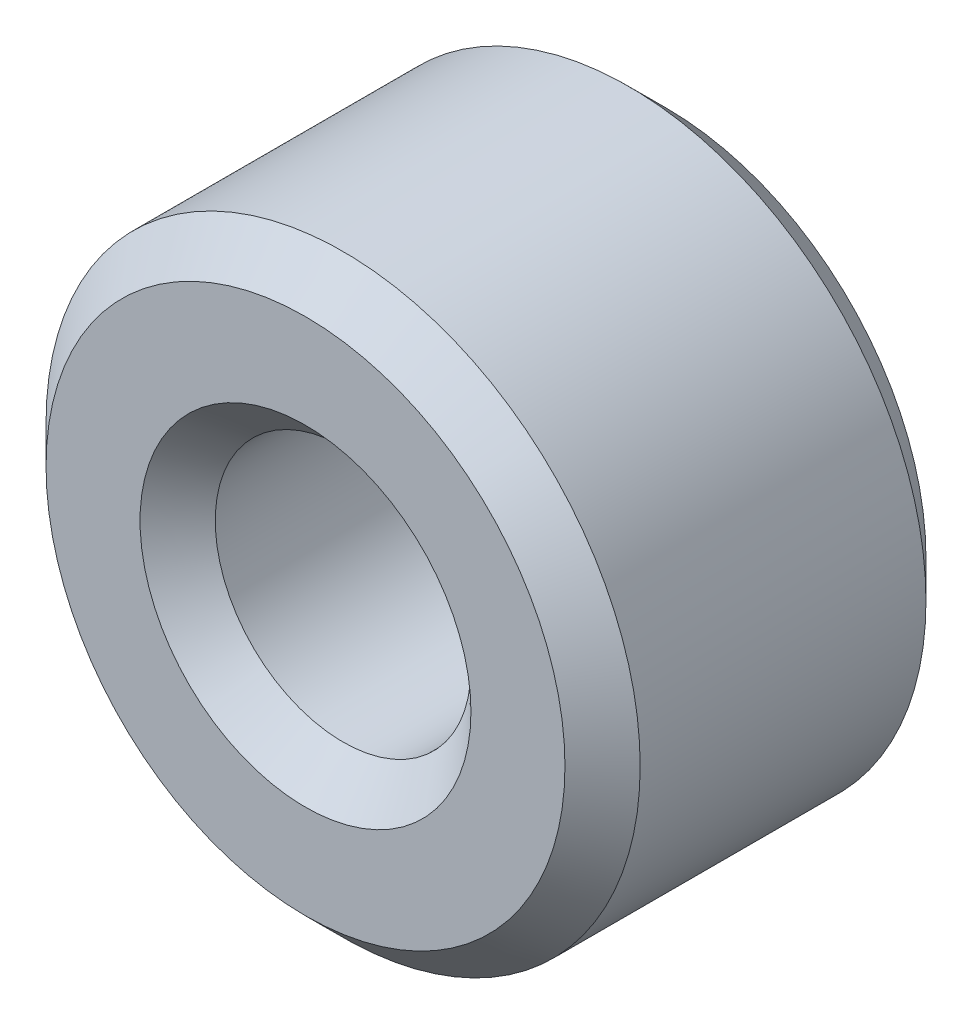
ISO-10303-21;
HEADER;
FILE_DESCRIPTION(('STEP AP214'),'2;1');
FILE_NAME('part.step','',(''),(''),'','','');
FILE_SCHEMA(('AUTOMOTIVE_DESIGN { 1 0 10303 214 1 1 1 1 }'));
ENDSEC;
DATA;
#1=APPLICATION_CONTEXT('core data for automotive mechanical design processes');
#2=APPLICATION_PROTOCOL_DEFINITION('international standard','automotive_design',2000,#1);
#3=PRODUCT_CONTEXT('',#1,'mechanical');
#4=PRODUCT('Part','Part','',(#3));
#5=PRODUCT_RELATED_PRODUCT_CATEGORY('part','',(#4));
#6=PRODUCT_DEFINITION_FORMATION('','',#4);
#7=PRODUCT_DEFINITION_CONTEXT('part definition',#1,'design');
#8=PRODUCT_DEFINITION('design','',#6,#7);
#9=PRODUCT_DEFINITION_SHAPE('','',#8);
#10=(LENGTH_UNIT() NAMED_UNIT(*) SI_UNIT(.MILLI.,.METRE.));
#11=(NAMED_UNIT(*) PLANE_ANGLE_UNIT() SI_UNIT($,.RADIAN.));
#12=(NAMED_UNIT(*) SI_UNIT($,.STERADIAN.) SOLID_ANGLE_UNIT());
#13=UNCERTAINTY_MEASURE_WITH_UNIT(LENGTH_MEASURE(1.E-05),#10,'distance_accuracy_value','');
#14=(GEOMETRIC_REPRESENTATION_CONTEXT(3) GLOBAL_UNCERTAINTY_ASSIGNED_CONTEXT((#13)) GLOBAL_UNIT_ASSIGNED_CONTEXT((#10,
#11,#12)) REPRESENTATION_CONTEXT('',''));
#15=CARTESIAN_POINT('',(0.,0.,0.));
#16=DIRECTION('',(0.,0.,1.));
#17=DIRECTION('',(1.,0.,0.));
#18=AXIS2_PLACEMENT_3D('',#15,#16,#17);
#19=CARTESIAN_POINT('',(-7.60000024181423,9.3620004416228,4.8));
#20=DIRECTION('',(0.,0.,1.));
#21=DIRECTION('',(1.,0.,0.));
#22=AXIS2_PLACEMENT_3D('',#19,#20,#21);
#23=PLANE('',#22);
#24=CARTESIAN_POINT('',(-7.60000024181423,9.3620004416228,4.8));
#25=DIRECTION('',(0.,0.,1.));
#26=DIRECTION('',(1.,0.,0.));
#27=AXIS2_PLACEMENT_3D('',#24,#25,#26);
#28=CIRCLE('',#27,2.2);
#29=CARTESIAN_POINT('',(-5.40000024181423,9.3620004416228,4.8));
#30=VERTEX_POINT('',#29);
#31=EDGE_CURVE('E10',#30,#30,#28,.F.);
#32=ORIENTED_EDGE('',*,*,#31,.T.);
#33=EDGE_LOOP('',(#32));
#34=FACE_BOUND('',#33,.T.);
#35=CARTESIAN_POINT('',(-7.60000024181423,9.3620004416228,4.8));
#36=DIRECTION('',(0.,0.,1.));
#37=DIRECTION('',(1.,0.,0.));
#38=AXIS2_PLACEMENT_3D('',#35,#36,#37);
#39=CIRCLE('',#38,3.45);
#40=CARTESIAN_POINT('',(-4.15000024181423,9.3620004416228,4.8));
#41=VERTEX_POINT('',#40);
#42=EDGE_CURVE('E39',#41,#41,#39,.T.);
#43=ORIENTED_EDGE('',*,*,#42,.T.);
#44=EDGE_LOOP('',(#43));
#45=FACE_BOUND('',#44,.T.);
#46=ADVANCED_FACE('F32',(#34,#45),#23,.T.);
#47=CARTESIAN_POINT('',(-7.60000024181423,9.3620004416228,0.));
#48=DIRECTION('',(0.,0.,1.));
#49=DIRECTION('',(1.,0.,0.));
#50=AXIS2_PLACEMENT_3D('',#47,#48,#49);
#51=PLANE('',#50);
#52=CARTESIAN_POINT('',(-7.60000024181423,9.3620004416228,0.));
#53=DIRECTION('',(0.,0.,1.));
#54=DIRECTION('',(1.,0.,0.));
#55=AXIS2_PLACEMENT_3D('',#52,#53,#54);
#56=CIRCLE('',#55,2.2);
#57=CARTESIAN_POINT('',(-5.40000024181423,9.3620004416228,0.));
#58=VERTEX_POINT('',#57);
#59=EDGE_CURVE('E58',#58,#58,#56,.T.);
#60=ORIENTED_EDGE('',*,*,#59,.T.);
#61=EDGE_LOOP('',(#60));
#62=FACE_BOUND('',#61,.T.);
#63=CARTESIAN_POINT('',(-7.60000024181423,9.3620004416228,0.));
#64=DIRECTION('',(0.,0.,1.));
#65=DIRECTION('',(1.,0.,0.));
#66=AXIS2_PLACEMENT_3D('',#63,#64,#65);
#67=CIRCLE('',#66,3.45);
#68=CARTESIAN_POINT('',(-4.15000024181423,9.3620004416228,0.));
#69=VERTEX_POINT('',#68);
#70=EDGE_CURVE('E61',#69,#69,#67,.F.);
#71=ORIENTED_EDGE('',*,*,#70,.T.);
#72=EDGE_LOOP('',(#71));
#73=FACE_BOUND('',#72,.T.);
#74=ADVANCED_FACE('F65',(#62,#73),#51,.F.);
#75=CARTESIAN_POINT('',(-7.60000024181423,9.3620004416228,4.8));
#76=DIRECTION('',(0.,0.,-1.));
#77=DIRECTION('',(-1.,0.,0.));
#78=AXIS2_PLACEMENT_3D('',#75,#76,#77);
#79=CYLINDRICAL_SURFACE('',#78,3.95);
#80=CARTESIAN_POINT('',(-7.60000024181423,9.3620004416228,0.500000000000001));
#81=DIRECTION('',(0.,0.,1.));
#82=DIRECTION('',(1.,0.,0.));
#83=AXIS2_PLACEMENT_3D('',#80,#81,#82);
#84=CIRCLE('',#83,3.95);
#85=CARTESIAN_POINT('',(-3.65000024181423,9.3620004416228,0.500000000000001));
#86=VERTEX_POINT('',#85);
#87=EDGE_CURVE('E43',#86,#86,#84,.T.);
#88=ORIENTED_EDGE('',*,*,#87,.T.);
#89=EDGE_LOOP('',(#88));
#90=FACE_BOUND('',#89,.T.);
#91=CARTESIAN_POINT('',(-7.60000024181423,9.3620004416228,4.3));
#92=DIRECTION('',(0.,0.,1.));
#93=DIRECTION('',(1.,0.,0.));
#94=AXIS2_PLACEMENT_3D('',#91,#92,#93);
#95=CIRCLE('',#94,3.95);
#96=CARTESIAN_POINT('',(-3.65000024181423,9.3620004416228,4.3));
#97=VERTEX_POINT('',#96);
#98=EDGE_CURVE('E47',#97,#97,#95,.F.);
#99=ORIENTED_EDGE('',*,*,#98,.T.);
#100=EDGE_LOOP('',(#99));
#101=FACE_BOUND('',#100,.T.);
#102=ADVANCED_FACE('F75',(#90,#101),#79,.T.);
#103=CARTESIAN_POINT('',(-7.60000024181423,9.3620004416228,4.8));
#104=DIRECTION('',(0.,0.,-1.));
#105=DIRECTION('',(-1.,0.,0.));
#106=AXIS2_PLACEMENT_3D('',#103,#104,#105);
#107=CYLINDRICAL_SURFACE('',#106,1.7);
#108=CARTESIAN_POINT('',(-7.60000024181423,9.3620004416228,0.500000000000001));
#109=DIRECTION('',(0.,0.,1.));
#110=DIRECTION('',(1.,0.,0.));
#111=AXIS2_PLACEMENT_3D('',#108,#109,#110);
#112=CIRCLE('',#111,1.7);
#113=CARTESIAN_POINT('',(-5.90000024181423,9.3620004416228,0.500000000000001));
#114=VERTEX_POINT('',#113);
#115=EDGE_CURVE('E52',#114,#114,#112,.F.);
#116=ORIENTED_EDGE('',*,*,#115,.T.);
#117=EDGE_LOOP('',(#116));
#118=FACE_BOUND('',#117,.T.);
#119=CARTESIAN_POINT('',(-7.60000024181423,9.3620004416228,4.3));
#120=DIRECTION('',(0.,0.,1.));
#121=DIRECTION('',(1.,0.,0.));
#122=AXIS2_PLACEMENT_3D('',#119,#120,#121);
#123=CIRCLE('',#122,1.7);
#124=CARTESIAN_POINT('',(-5.90000024181423,9.3620004416228,4.3));
#125=VERTEX_POINT('',#124);
#126=EDGE_CURVE('E55',#125,#125,#123,.T.);
#127=ORIENTED_EDGE('',*,*,#126,.T.);
#128=EDGE_LOOP('',(#127));
#129=FACE_BOUND('',#128,.T.);
#130=ADVANCED_FACE('F78',(#118,#129),#107,.F.);
#131=CARTESIAN_POINT('',(-7.60000024181423,9.3620004416228,0.));
#132=DIRECTION('',(0.,0.,-1.));
#133=DIRECTION('',(-1.,0.,0.));
#134=AXIS2_PLACEMENT_3D('',#131,#132,#133);
#135=CONICAL_SURFACE('',#134,2.2,0.785398163397447);
#136=ORIENTED_EDGE('',*,*,#115,.F.);
#137=EDGE_LOOP('',(#136));
#138=FACE_BOUND('',#137,.T.);
#139=ORIENTED_EDGE('',*,*,#59,.F.);
#140=EDGE_LOOP('',(#139));
#141=FACE_BOUND('',#140,.T.);
#142=ADVANCED_FACE('F71',(#138,#141),#135,.F.);
#143=CARTESIAN_POINT('',(-7.60000024181423,9.3620004416228,0.500000000000001));
#144=DIRECTION('',(0.,0.,1.));
#145=DIRECTION('',(1.,0.,0.));
#146=AXIS2_PLACEMENT_3D('',#143,#144,#145);
#147=CONICAL_SURFACE('',#146,3.95,0.785398163397448);
#148=ORIENTED_EDGE('',*,*,#70,.F.);
#149=EDGE_LOOP('',(#148));
#150=FACE_BOUND('',#149,.T.);
#151=ORIENTED_EDGE('',*,*,#87,.F.);
#152=EDGE_LOOP('',(#151));
#153=FACE_BOUND('',#152,.T.);
#154=ADVANCED_FACE('F67',(#150,#153),#147,.T.);
#155=CARTESIAN_POINT('',(-7.60000024181423,9.3620004416228,4.3));
#156=DIRECTION('',(0.,0.,1.));
#157=DIRECTION('',(1.,0.,0.));
#158=AXIS2_PLACEMENT_3D('',#155,#156,#157);
#159=CONICAL_SURFACE('',#158,1.7,0.785398163397448);
#160=ORIENTED_EDGE('',*,*,#31,.F.);
#161=EDGE_LOOP('',(#160));
#162=FACE_BOUND('',#161,.T.);
#163=ORIENTED_EDGE('',*,*,#126,.F.);
#164=EDGE_LOOP('',(#163));
#165=FACE_BOUND('',#164,.T.);
#166=ADVANCED_FACE('F70',(#162,#165),#159,.F.);
#167=CARTESIAN_POINT('',(-7.60000024181423,9.3620004416228,4.8));
#168=DIRECTION('',(0.,0.,-1.));
#169=DIRECTION('',(-1.,0.,0.));
#170=AXIS2_PLACEMENT_3D('',#167,#168,#169);
#171=CONICAL_SURFACE('',#170,3.45,0.785398163397446);
#172=ORIENTED_EDGE('',*,*,#98,.F.);
#173=EDGE_LOOP('',(#172));
#174=FACE_BOUND('',#173,.T.);
#175=ORIENTED_EDGE('',*,*,#42,.F.);
#176=EDGE_LOOP('',(#175));
#177=FACE_BOUND('',#176,.T.);
#178=ADVANCED_FACE('F34',(#174,#177),#171,.T.);
#179=CLOSED_SHELL('',(#46,#74,#102,#130,#142,#154,#166,#178));
#180=MANIFOLD_SOLID_BREP('B2',#179);
#181=ADVANCED_BREP_SHAPE_REPRESENTATION('',(#18,#180),#14);
#182=SHAPE_DEFINITION_REPRESENTATION(#9,#181);
ENDSEC;
END-ISO-10303-21;
